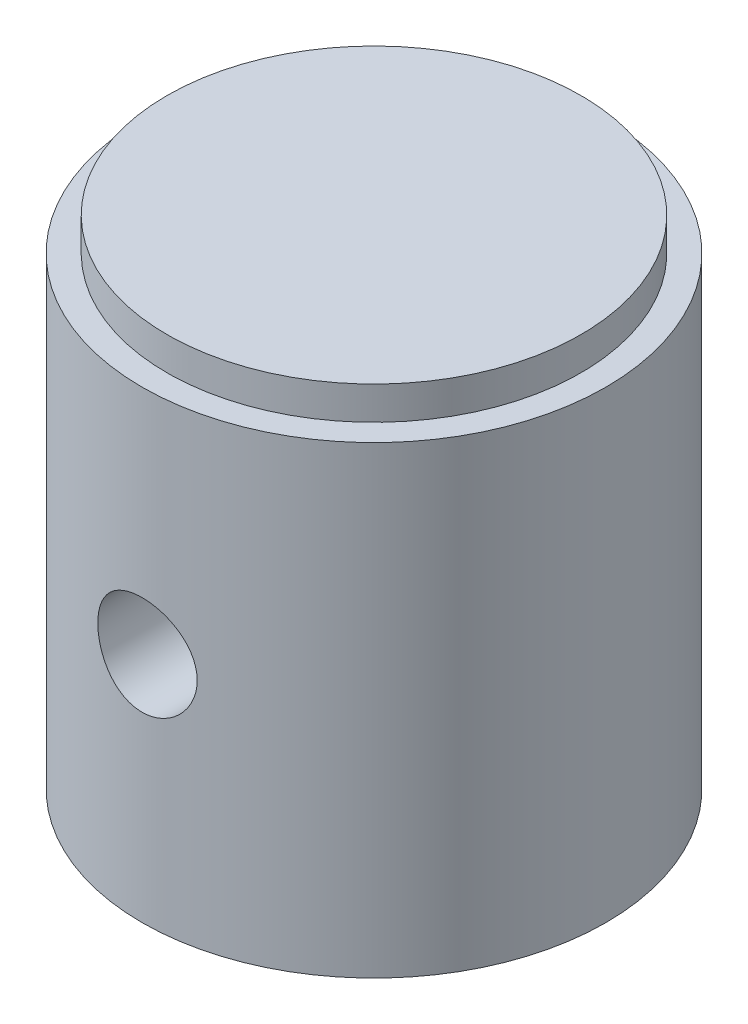
ISO-10303-21;
HEADER;
FILE_DESCRIPTION(('STEP AP214'),'2;1');
FILE_NAME('part.step','',(''),(''),'','','');
FILE_SCHEMA(('AUTOMOTIVE_DESIGN { 1 0 10303 214 1 1 1 1 }'));
ENDSEC;
DATA;
#1=APPLICATION_CONTEXT('core data for automotive mechanical design processes');
#2=APPLICATION_PROTOCOL_DEFINITION('international standard','automotive_design',2000,#1);
#3=PRODUCT_CONTEXT('',#1,'mechanical');
#4=PRODUCT('Part','Part','',(#3));
#5=PRODUCT_RELATED_PRODUCT_CATEGORY('part','',(#4));
#6=PRODUCT_DEFINITION_FORMATION('','',#4);
#7=PRODUCT_DEFINITION_CONTEXT('part definition',#1,'design');
#8=PRODUCT_DEFINITION('design','',#6,#7);
#9=PRODUCT_DEFINITION_SHAPE('','',#8);
#10=(LENGTH_UNIT() NAMED_UNIT(*) SI_UNIT(.MILLI.,.METRE.));
#11=(NAMED_UNIT(*) PLANE_ANGLE_UNIT() SI_UNIT($,.RADIAN.));
#12=(NAMED_UNIT(*) SI_UNIT($,.STERADIAN.) SOLID_ANGLE_UNIT());
#13=UNCERTAINTY_MEASURE_WITH_UNIT(LENGTH_MEASURE(1.E-05),#10,'distance_accuracy_value','');
#14=(GEOMETRIC_REPRESENTATION_CONTEXT(3) GLOBAL_UNCERTAINTY_ASSIGNED_CONTEXT((#13)) GLOBAL_UNIT_ASSIGNED_CONTEXT((#10,
#11,#12)) REPRESENTATION_CONTEXT('',''));
#15=CARTESIAN_POINT('',(0.,0.,0.));
#16=DIRECTION('',(0.,0.,1.));
#17=DIRECTION('',(1.,0.,0.));
#18=AXIS2_PLACEMENT_3D('',#15,#16,#17);
#19=CARTESIAN_POINT('',(0.,1.14591205961906,0.));
#20=DIRECTION('',(0.,1.,0.));
#21=DIRECTION('',(-1.,0.,0.));
#22=AXIS2_PLACEMENT_3D('',#19,#20,#21);
#23=PLANE('',#22);
#24=CARTESIAN_POINT('',(0.,1.14591205961906,0.));
#25=DIRECTION('',(0.,1.,0.));
#26=DIRECTION('',(-1.,0.,0.));
#27=AXIS2_PLACEMENT_3D('',#24,#25,#26);
#28=CIRCLE('',#27,6.25);
#29=CARTESIAN_POINT('',(-6.25,1.14591205961906,0.));
#30=VERTEX_POINT('',#29);
#31=EDGE_CURVE('E11',#30,#30,#28,.T.);
#32=ORIENTED_EDGE('',*,*,#31,.T.);
#33=EDGE_LOOP('',(#32));
#34=FACE_BOUND('',#33,.T.);
#35=ADVANCED_FACE('F42',(#34),#23,.T.);
#36=CARTESIAN_POINT('',(0.,1.14591205961906,0.));
#37=DIRECTION('',(0.,1.,0.));
#38=DIRECTION('',(-1.,0.,0.));
#39=AXIS2_PLACEMENT_3D('',#36,#37,#38);
#40=CYLINDRICAL_SURFACE('',#39,6.25);
#41=CARTESIAN_POINT('',(0.,0.145912059619056,0.));
#42=DIRECTION('',(0.,1.,0.));
#43=DIRECTION('',(-1.,0.,0.));
#44=AXIS2_PLACEMENT_3D('',#41,#42,#43);
#45=CIRCLE('',#44,6.25);
#46=CARTESIAN_POINT('',(-6.25,0.145912059619056,0.));
#47=VERTEX_POINT('',#46);
#48=EDGE_CURVE('E55',#47,#47,#45,.T.);
#49=ORIENTED_EDGE('',*,*,#48,.T.);
#50=EDGE_LOOP('',(#49));
#51=FACE_BOUND('',#50,.T.);
#52=ORIENTED_EDGE('',*,*,#31,.F.);
#53=EDGE_LOOP('',(#52));
#54=FACE_BOUND('',#53,.T.);
#55=ADVANCED_FACE('F130',(#51,#54),#40,.T.);
#56=CARTESIAN_POINT('',(-6.25,0.145912059619056,0.));
#57=DIRECTION('',(0.,1.,0.));
#58=DIRECTION('',(-1.,0.,0.));
#59=AXIS2_PLACEMENT_3D('',#56,#57,#58);
#60=PLANE('',#59);
#61=CARTESIAN_POINT('',(0.,0.145912059619056,0.));
#62=DIRECTION('',(0.,1.,0.));
#63=DIRECTION('',(-1.,0.,0.));
#64=AXIS2_PLACEMENT_3D('',#61,#62,#63);
#65=CIRCLE('',#64,7.);
#66=CARTESIAN_POINT('',(-7.,0.145912059619056,0.));
#67=VERTEX_POINT('',#66);
#68=EDGE_CURVE('E94',#67,#67,#65,.T.);
#69=ORIENTED_EDGE('',*,*,#68,.T.);
#70=EDGE_LOOP('',(#69));
#71=FACE_BOUND('',#70,.T.);
#72=ORIENTED_EDGE('',*,*,#48,.F.);
#73=EDGE_LOOP('',(#72));
#74=FACE_BOUND('',#73,.T.);
#75=ADVANCED_FACE('F126',(#71,#74),#60,.T.);
#76=CARTESIAN_POINT('',(0.,1.14591205961906,0.));
#77=DIRECTION('',(0.,1.,0.));
#78=DIRECTION('',(-1.,0.,0.));
#79=AXIS2_PLACEMENT_3D('',#76,#77,#78);
#80=CYLINDRICAL_SURFACE('',#79,7.);
#81=CARTESIAN_POINT('',(0.,-5.35408794038094,-7.));
#82=CARTESIAN_POINT('',(0.0832358860906167,-5.35409083995524,-6.99999846043226));
#83=CARTESIAN_POINT('',(0.166507195600275,-5.3610395487688,-6.9985002594971));
#84=CARTESIAN_POINT('',(0.330687344293327,-5.38862359723453,-6.99266829827727));
#85=CARTESIAN_POINT('',(0.41159440357119,-5.40926898457588,-6.98833245637099));
#86=CARTESIAN_POINT('',(0.568649323817737,-5.46357230498898,-6.97730831788826));
#87=CARTESIAN_POINT('',(0.644801963446556,-5.49721691976226,-6.97062242967171));
#88=CARTESIAN_POINT('',(0.790378177960787,-5.5765220265522,-6.95562106817971));
#89=CARTESIAN_POINT('',(0.859801981747369,-5.62218210963088,-6.9473056503666));
#90=CARTESIAN_POINT('',(0.99102479053523,-5.72496824005445,-6.92981369246311));
#91=CARTESIAN_POINT('',(1.05270503419445,-5.78224416227947,-6.92062683143259));
#92=CARTESIAN_POINT('',(1.16566042389435,-5.90631425606614,-6.90250069814144));
#93=CARTESIAN_POINT('',(1.21693467150908,-5.9731092486322,-6.8935614473163));
#94=CARTESIAN_POINT('',(1.30814204379809,-6.11519369324137,-6.87684116047225));
#95=CARTESIAN_POINT('',(1.34794958335009,-6.19056545813715,-6.8690733634436));
#96=CARTESIAN_POINT('',(1.41428823691148,-6.34712239414778,-6.85572325558537));
#97=CARTESIAN_POINT('',(1.44082087001716,-6.42830689887351,-6.85014069470711));
#98=CARTESIAN_POINT('',(1.47946574422454,-6.59289902696901,-6.8418980892631));
#99=CARTESIAN_POINT('',(1.49178779748342,-6.67625521604481,-6.83919556896486));
#100=CARTESIAN_POINT('',(1.50231395206577,-6.84389217288794,-6.83689139845106));
#101=CARTESIAN_POINT('',(1.50051971664629,-6.92817283056089,-6.83728938291729));
#102=CARTESIAN_POINT('',(1.48303326340861,-7.09371262831473,-6.84110276603832));
#103=CARTESIAN_POINT('',(1.46758398649408,-7.17499882948109,-6.84446541682162));
#104=CARTESIAN_POINT('',(1.42361054298677,-7.33379818067028,-6.85374593375788));
#105=CARTESIAN_POINT('',(1.39508566936466,-7.41131112641326,-6.85966393808402));
#106=CARTESIAN_POINT('',(1.32554551075991,-7.56105081325428,-6.87344080755724));
#107=CARTESIAN_POINT('',(1.2844361097283,-7.63323245309349,-6.88131420983365));
#108=CARTESIAN_POINT('',(1.19096007283993,-7.7697631053389,-6.89810572501288));
#109=CARTESIAN_POINT('',(1.13859196103562,-7.83411108906714,-6.90702397481896));
#110=CARTESIAN_POINT('',(1.0227954275532,-7.95454729605434,-6.92512718393878));
#111=CARTESIAN_POINT('',(0.959160233964409,-8.01043664696568,-6.93431383972178));
#112=CARTESIAN_POINT('',(0.823317306269096,-8.1107816740706,-6.95175017497059));
#113=CARTESIAN_POINT('',(0.751109428775399,-8.15523715898133,-6.95999983875972));
#114=CARTESIAN_POINT('',(0.599933462049958,-8.23149862028787,-6.97465778534003));
#115=CARTESIAN_POINT('',(0.520952258863481,-8.26327935295892,-6.98106238643354));
#116=CARTESIAN_POINT('',(0.358603146685705,-8.31306358870203,-6.99128109245334));
#117=CARTESIAN_POINT('',(0.275235851133668,-8.33106901294426,-6.99509555860384));
#118=CARTESIAN_POINT('',(0.108187670836628,-8.35250415452437,-6.99965306347808));
#119=CARTESIAN_POINT('',(0.0245431772716139,-8.35620565326272,-7.00045336521066));
#120=CARTESIAN_POINT('',(-0.142168973650405,-8.34966336925578,-6.99905248935969));
#121=CARTESIAN_POINT('',(-0.225236668127256,-8.339420492418,-6.99685150675698));
#122=CARTESIAN_POINT('',(-0.387542537982806,-8.30550569671924,-6.98973143045266));
#123=CARTESIAN_POINT('',(-0.466811712908478,-8.28197557090841,-6.98484105045459));
#124=CARTESIAN_POINT('',(-0.620278450473418,-8.22231099738612,-6.9728892442151));
#125=CARTESIAN_POINT('',(-0.69447559258774,-8.18617550606929,-6.96582763822237));
#126=CARTESIAN_POINT('',(-0.836821397964754,-8.10175439732062,-6.950175043904));
#127=CARTESIAN_POINT('',(-0.904872575111141,-8.05330814547121,-6.94156431354275));
#128=CARTESIAN_POINT('',(-1.0319769255236,-7.9458531154922,-6.92381033034847));
#129=CARTESIAN_POINT('',(-1.091028978692,-7.8868430244935,-6.91466701142097));
#130=CARTESIAN_POINT('',(-1.19952711057989,-7.7586905701938,-6.89668172706324));
#131=CARTESIAN_POINT('',(-1.24878537255157,-7.68938784115884,-6.88784792221285));
#132=CARTESIAN_POINT('',(-1.3349641538604,-7.54333334390295,-6.87166654559681));
#133=CARTESIAN_POINT('',(-1.37188519913706,-7.46658189340345,-6.86431891048055));
#134=CARTESIAN_POINT('',(-1.43209741248548,-7.30821564138634,-6.8520100980739));
#135=CARTESIAN_POINT('',(-1.45546398641275,-7.22663058395027,-6.84703574582967));
#136=CARTESIAN_POINT('',(-1.48812696085335,-7.0605723565473,-6.84001186708418));
#137=CARTESIAN_POINT('',(-1.49742550780258,-6.97609962917962,-6.83796189439706));
#138=CARTESIAN_POINT('',(-1.5015999992604,-6.8085555972057,-6.83704618848155));
#139=CARTESIAN_POINT('',(-1.49677347258311,-6.72549192540036,-6.83811476518543));
#140=CARTESIAN_POINT('',(-1.47349789406331,-6.56139069824835,-6.8431676318483));
#141=CARTESIAN_POINT('',(-1.45504898957979,-6.48035312099437,-6.84715189026714));
#142=CARTESIAN_POINT('',(-1.40519345940434,-6.32282928251177,-6.85755581104157));
#143=CARTESIAN_POINT('',(-1.37382847170887,-6.24632929171665,-6.86396764224703));
#144=CARTESIAN_POINT('',(-1.29906751595601,-6.09963256787409,-6.87850764590649));
#145=CARTESIAN_POINT('',(-1.255670353015,-6.0294364617659,-6.88663598880363));
#146=CARTESIAN_POINT('',(-1.15708290349304,-5.89586974665557,-6.90389055593232));
#147=CARTESIAN_POINT('',(-1.10167987421237,-5.83265824443396,-6.91303309938926));
#148=CARTESIAN_POINT('',(-0.98108655461962,-5.71633167786048,-6.93117449799694));
#149=CARTESIAN_POINT('',(-0.915894009385597,-5.66321894606874,-6.94017331951296));
#150=CARTESIAN_POINT('',(-0.776603147268717,-5.56797198087538,-6.95714491048987));
#151=CARTESIAN_POINT('',(-0.702404846009642,-5.52598133414996,-6.96510364570626));
#152=CARTESIAN_POINT('',(-0.547850160940599,-5.45513341147476,-6.97895826104019));
#153=CARTESIAN_POINT('',(-0.46749910586388,-5.42626491779591,-6.98485590212343));
#154=CARTESIAN_POINT('',(-0.322535217553203,-5.38773575524979,-6.99284848461772));
#155=CARTESIAN_POINT('',(-0.258717205545978,-5.37514150640091,-6.99551391888263));
#156=CARTESIAN_POINT('',(-0.129939960853846,-5.35831663866927,-6.99909024154719));
#157=CARTESIAN_POINT('',(-0.0649807750887446,-5.35408567673488,-7.00000120191314));
#158=CARTESIAN_POINT('',(0.,-5.35408794038094,-7.));
#159=B_SPLINE_CURVE_WITH_KNOTS('',3,(#81,#82,#83,#84,#85,#86,#87,#88,#89,#90,#91,#92,#93,#94,
#95,#96,#97,#98,#99,#100,#101,#102,#103,#104,#105,#106,#107,#108,#109,#110,#111,#112,#113,#114,
#115,#116,#117,#118,#119,#120,#121,#122,#123,#124,#125,#126,#127,#128,#129,#130,#131,#132,#133,
#134,#135,#136,#137,#138,#139,#140,#141,#142,#143,#144,#145,#146,#147,#148,#149,#150,#151,#152,
#153,#154,#155,#156,#157,#158),.UNSPECIFIED.,.T.,.F.,(4,2,2,2,2,2,2,2,2,2,2,2,2,2,2,2,2,2,2,2,2,
2,2,2,2,2,2,2,2,2,2,2,2,2,2,2,2,2,4),(0.,0.249469836512082,0.499122883219936,0.748520824425602,
0.997910278645887,1.25074961881732,1.50361077918506,1.7591442921451,2.0146485567749,
2.26633008124666,2.51798195169165,2.76524475452928,3.01252092904568,3.26169356165968,
3.51089887920889,3.76527011050291,4.0196455970235,4.27452521139806,4.52936927256343,
4.77934665704185,5.02930780231429,5.27665060589267,5.52401389198434,5.77478733867803,
6.02559197304485,6.28082063283534,6.53603841075806,6.78982240408475,7.04356767229185,
7.29200680540294,7.5404432510827,7.78808499706785,8.03575134451623,8.28822950154114,
8.54076590397115,8.79641910357222,9.05185334010271,9.24661799132294,9.44137465337336),.UNSPECIFIED.);
#160=CARTESIAN_POINT('',(0.,-5.35408794038094,-7.));
#161=VERTEX_POINT('',#160);
#162=EDGE_CURVE('E71',#161,#161,#159,.T.);
#163=ORIENTED_EDGE('',*,*,#162,.F.);
#164=EDGE_LOOP('',(#163));
#165=FACE_BOUND('',#164,.T.);
#166=CARTESIAN_POINT('',(1.5,-6.85408794038094,6.83739716558867));
#167=CARTESIAN_POINT('',(1.49999708238613,-6.77087678789899,6.83739884558951));
#168=CARTESIAN_POINT('',(1.49305236244768,-6.68763016643882,6.83893272341929));
#169=CARTESIAN_POINT('',(1.46548559252999,-6.52350126813893,6.84489178429867));
#170=CARTESIAN_POINT('',(1.44485339653622,-6.44262079170474,6.84931911211841));
#171=CARTESIAN_POINT('',(1.39058863684599,-6.28562219080674,6.86054115293409));
#172=CARTESIAN_POINT('',(1.35697000991314,-6.20949906225948,6.86733332725825));
#173=CARTESIAN_POINT('',(1.27772617673341,-6.06397266643633,6.88251670848644));
#174=CARTESIAN_POINT('',(1.23210132048776,-5.99456920335186,6.89090786877545));
#175=CARTESIAN_POINT('',(1.12935142570221,-5.86332497889882,6.90849578796654));
#176=CARTESIAN_POINT('',(1.07206859483983,-5.80160906414098,6.91770249871753));
#177=CARTESIAN_POINT('',(0.947969508129577,-5.68858438597515,6.93579691710397));
#178=CARTESIAN_POINT('',(0.881152530217675,-5.63727641152087,6.94468460051416));
#179=CARTESIAN_POINT('',(0.739047288464581,-5.54603249588951,6.96124769109432));
#180=CARTESIAN_POINT('',(0.663680488229953,-5.50621628461032,6.96890998819429));
#181=CARTESIAN_POINT('',(0.507134269342595,-5.43986024893465,6.98204671042934));
#182=CARTESIAN_POINT('',(0.425955477380311,-5.41331899559466,6.98752137103329));
#183=CARTESIAN_POINT('',(0.261387187671511,-5.3746579694496,6.9955956528118));
#184=CARTESIAN_POINT('',(0.178049400596923,-5.36232701182851,6.99823733378385));
#185=CARTESIAN_POINT('',(0.0104489453066437,-5.35177666306768,7.00049362207002));
#186=CARTESIAN_POINT('',(-0.0738136201647602,-5.35355571982018,7.00010856232698));
#187=CARTESIAN_POINT('',(-0.239417029250513,-5.37101690504452,6.99638700862558));
#188=CARTESIAN_POINT('',(-0.320783115362113,-5.38647144067086,6.99309883152431));
#189=CARTESIAN_POINT('',(-0.479739463978389,-5.4304826222328,6.98399541589104));
#190=CARTESIAN_POINT('',(-0.557329560175055,-5.45903984468068,6.97818006616518));
#191=CARTESIAN_POINT('',(-0.707167497556553,-5.52864939926946,6.96459754646858));
#192=CARTESIAN_POINT('',(-0.779373657015789,-5.56978870758529,6.95681685803946));
#193=CARTESIAN_POINT('',(-0.915940926562847,-5.66332990854454,6.94015793743865));
#194=CARTESIAN_POINT('',(-0.980301006451529,-5.71573327768124,6.93127956144693));
#195=CARTESIAN_POINT('',(-1.10070208800198,-5.8315564849088,6.91319326460925));
#196=CARTESIAN_POINT('',(-1.1565511732025,-5.89517551973798,6.90398230372853));
#197=CARTESIAN_POINT('',(-1.25682243234728,-6.03097122544945,6.88643566831974));
#198=CARTESIAN_POINT('',(-1.30124432118068,-6.10314810978619,6.87810001563386));
#199=CARTESIAN_POINT('',(-1.37748077573296,-6.2543124414447,6.86324023586723));
#200=CARTESIAN_POINT('',(-1.40926035088923,-6.33331806423338,6.85672115127775));
#201=CARTESIAN_POINT('',(-1.45903495159116,-6.49572070632738,6.84630340806616));
#202=CARTESIAN_POINT('',(-1.47703206694628,-6.57911705782413,6.84240435218483));
#203=CARTESIAN_POINT('',(-1.49843586024652,-6.74618369303065,6.83774881255446));
#204=CARTESIAN_POINT('',(-1.5021214192864,-6.82981661545825,6.83693227051701));
#205=CARTESIAN_POINT('',(-1.49555139642373,-6.99650193356264,6.83837239573993));
#206=CARTESIAN_POINT('',(-1.48529673081635,-7.07955436703449,6.84062886101063));
#207=CARTESIAN_POINT('',(-1.45137894635584,-7.2417583753617,6.84790415484205));
#208=CARTESIAN_POINT('',(-1.42786830251553,-7.3209433729779,6.85289155274364));
#209=CARTESIAN_POINT('',(-1.36827052946749,-7.47425027791386,6.86503859869777));
#210=CARTESIAN_POINT('',(-1.33218223662818,-7.54837171601513,6.87219844772849));
#211=CARTESIAN_POINT('',(-1.24783504416705,-7.69065762513986,6.88801634080345));
#212=CARTESIAN_POINT('',(-1.19940368590792,-7.75871752239313,6.89669501746317));
#213=CARTESIAN_POINT('',(-1.09197183833601,-7.88584628625474,6.91451775360139));
#214=CARTESIAN_POINT('',(-1.03297009182161,-7.94491408182941,6.92366186834461));
#215=CARTESIAN_POINT('',(-0.904812764420814,-8.0534582433257,6.94158239990173));
#216=CARTESIAN_POINT('',(-0.835494925828771,-8.10274485653795,6.95034935607746));
#217=CARTESIAN_POINT('',(-0.689401481282275,-8.18897334973199,6.96635610714901));
#218=CARTESIAN_POINT('',(-0.612626216043739,-8.22591579335377,6.97359597176692));
#219=CARTESIAN_POINT('',(-0.454265418982039,-8.28613999501942,6.98569278381574));
#220=CARTESIAN_POINT('',(-0.372713193075171,-8.30950624412722,6.99056443803698));
#221=CARTESIAN_POINT('',(-0.206725177003288,-8.34217964611326,6.9974393930198));
#222=CARTESIAN_POINT('',(-0.122289789973992,-8.35148875635485,6.99944309312296));
#223=CARTESIAN_POINT('',(0.0452637170528297,-8.3556985927928,7.00034511009056));
#224=CARTESIAN_POINT('',(0.12837450550923,-8.35088309898556,6.99930459001667));
#225=CARTESIAN_POINT('',(0.292572938415961,-8.32761317686191,6.99436552363383));
#226=CARTESIAN_POINT('',(0.373660616405285,-8.30915897480262,6.99046702473686));
#227=CARTESIAN_POINT('',(0.53130194848727,-8.25926913413145,6.98025388638537));
#228=CARTESIAN_POINT('',(0.607868365073178,-8.22787225099538,6.97394646430492));
#229=CARTESIAN_POINT('',(0.75468495672322,-8.15302666921182,6.9595903605066));
#230=CARTESIAN_POINT('',(0.824934544796142,-8.10957685207491,6.9515415172034));
#231=CARTESIAN_POINT('',(0.958512306895244,-8.01092562163827,6.93439809934493));
#232=CARTESIAN_POINT('',(1.02169036510577,-7.95552378205963,6.92528708907874));
#233=CARTESIAN_POINT('',(1.13795001457643,-7.83494733013059,6.90713690075836));
#234=CARTESIAN_POINT('',(1.19102918062422,-7.76977037702533,6.89809774045682));
#235=CARTESIAN_POINT('',(1.28623261596675,-7.63049744719526,6.88098693651915));
#236=CARTESIAN_POINT('',(1.32820897809616,-7.55629858209392,6.87292905956533));
#237=CARTESIAN_POINT('',(1.39903004659825,-7.40174421945769,6.85886497228049));
#238=CARTESIAN_POINT('',(1.42788606423931,-7.32139409512787,6.85285699581573));
#239=CARTESIAN_POINT('',(1.46638607121558,-7.17646180919508,6.84470560641996));
#240=CARTESIAN_POINT('',(1.47896752507743,-7.11267626467311,6.84198283087953));
#241=CARTESIAN_POINT('',(1.49577544043437,-6.98396362880362,6.83832799504406));
#242=CARTESIAN_POINT('',(1.50000227727981,-6.91903658887262,6.83739585430069));
#243=CARTESIAN_POINT('',(1.5,-6.85408794038094,6.83739716558867));
#244=B_SPLINE_CURVE_WITH_KNOTS('',3,(#166,#167,#168,#169,#170,#171,#172,#173,#174,#175,#176,
#177,#178,#179,#180,#181,#182,#183,#184,#185,#186,#187,#188,#189,#190,#191,#192,#193,#194,#195,
#196,#197,#198,#199,#200,#201,#202,#203,#204,#205,#206,#207,#208,#209,#210,#211,#212,#213,#214,
#215,#216,#217,#218,#219,#220,#221,#222,#223,#224,#225,#226,#227,#228,#229,#230,#231,#232,#233,
#234,#235,#236,#237,#238,#239,#240,#241,#242,#243),.UNSPECIFIED.,.T.,.F.,(4,2,2,2,2,2,2,2,2,2,2,
2,2,2,2,2,2,2,2,2,2,2,2,2,2,2,2,2,2,2,2,2,2,2,2,2,2,2,4),(0.,0.249395482027528,
0.498976038479964,0.748289491152759,0.997595676735283,1.25053229582692,1.50348808112879,
1.75899134820278,2.01446710646268,2.26609508151929,2.51769537777241,2.76518557667372,
3.01268666607584,3.26193888143437,3.51122378872315,3.76548960779295,4.01976177023092,
4.27473287411781,4.52966530953839,4.77960433192523,5.02952692653917,5.27663180749375,
5.5237595556315,5.77455010216318,6.02537049659078,6.2806621468321,6.53594213875541,
6.78961589824375,7.04325433208539,7.29183199644127,7.540405537151,7.78824009619483,
8.03609766151365,8.28848914160965,8.54094115631232,8.79660380167248,9.05204561611687,
9.24671456122272,9.44137476018022),.UNSPECIFIED.);
#245=CARTESIAN_POINT('',(1.5,-6.85408794038094,6.83739716558867));
#246=VERTEX_POINT('',#245);
#247=EDGE_CURVE('E79',#246,#246,#244,.T.);
#248=ORIENTED_EDGE('',*,*,#247,.F.);
#249=EDGE_LOOP('',(#248));
#250=FACE_BOUND('',#249,.T.);
#251=CARTESIAN_POINT('',(0.,-13.8540879403809,0.));
#252=DIRECTION('',(0.,1.,0.));
#253=DIRECTION('',(-1.,0.,0.));
#254=AXIS2_PLACEMENT_3D('',#251,#252,#253);
#255=CIRCLE('',#254,7.);
#256=CARTESIAN_POINT('',(-7.,-13.8540879403809,0.));
#257=VERTEX_POINT('',#256);
#258=EDGE_CURVE('E90',#257,#257,#255,.T.);
#259=ORIENTED_EDGE('',*,*,#258,.T.);
#260=EDGE_LOOP('',(#259));
#261=FACE_BOUND('',#260,.T.);
#262=ORIENTED_EDGE('',*,*,#68,.F.);
#263=EDGE_LOOP('',(#262));
#264=FACE_BOUND('',#263,.T.);
#265=ADVANCED_FACE('F120',(#165,#250,#261,#264),#80,.T.);
#266=CARTESIAN_POINT('',(-7.,-13.8540879403809,0.));
#267=DIRECTION('',(0.,-1.,0.));
#268=DIRECTION('',(1.,0.,0.));
#269=AXIS2_PLACEMENT_3D('',#266,#267,#268);
#270=PLANE('',#269);
#271=CARTESIAN_POINT('',(0.,-13.8540879403809,0.));
#272=DIRECTION('',(0.,1.,0.));
#273=DIRECTION('',(-1.,0.,0.));
#274=AXIS2_PLACEMENT_3D('',#271,#272,#273);
#275=CIRCLE('',#274,6.25);
#276=CARTESIAN_POINT('',(-6.25,-13.8540879403809,0.));
#277=VERTEX_POINT('',#276);
#278=EDGE_CURVE('E76',#277,#277,#275,.T.);
#279=ORIENTED_EDGE('',*,*,#278,.T.);
#280=EDGE_LOOP('',(#279));
#281=FACE_BOUND('',#280,.T.);
#282=ORIENTED_EDGE('',*,*,#258,.F.);
#283=EDGE_LOOP('',(#282));
#284=FACE_BOUND('',#283,.T.);
#285=ADVANCED_FACE('F125',(#281,#284),#270,.T.);
#286=CARTESIAN_POINT('',(0.,-13.8540879403809,0.));
#287=DIRECTION('',(0.,-1.,0.));
#288=DIRECTION('',(1.,0.,0.));
#289=AXIS2_PLACEMENT_3D('',#286,#287,#288);
#290=CONICAL_SURFACE('',#289,6.25,0.349065850398867);
#291=CARTESIAN_POINT('',(0.,-9.73287181119902,0.));
#292=DIRECTION('',(0.,1.,0.));
#293=DIRECTION('',(-1.,0.,0.));
#294=AXIS2_PLACEMENT_3D('',#291,#292,#293);
#295=CIRCLE('',#294,4.75);
#296=CARTESIAN_POINT('',(-4.75,-9.73287181119902,0.));
#297=VERTEX_POINT('',#296);
#298=EDGE_CURVE('E70',#297,#297,#295,.T.);
#299=ORIENTED_EDGE('',*,*,#298,.T.);
#300=EDGE_LOOP('',(#299));
#301=FACE_BOUND('',#300,.T.);
#302=ORIENTED_EDGE('',*,*,#278,.F.);
#303=EDGE_LOOP('',(#302));
#304=FACE_BOUND('',#303,.T.);
#305=ADVANCED_FACE('F167',(#301,#304),#290,.F.);
#306=CARTESIAN_POINT('',(0.,1.14591205961906,0.));
#307=DIRECTION('',(0.,1.,0.));
#308=DIRECTION('',(-1.,0.,0.));
#309=AXIS2_PLACEMENT_3D('',#306,#307,#308);
#310=CYLINDRICAL_SURFACE('',#309,4.75);
#311=CARTESIAN_POINT('',(1.5,-6.85408794038094,-4.50693909432999));
#312=CARTESIAN_POINT('',(1.49999958004515,-6.7721196577048,-4.50693949515469));
#313=CARTESIAN_POINT('',(1.49325840231682,-6.6901469566562,-4.50919970874085));
#314=CARTESIAN_POINT('',(1.46655104887094,-6.52861293088149,-4.5179553253781));
#315=CARTESIAN_POINT('',(1.44658152131253,-6.44905222265826,-4.52445180182028));
#316=CARTESIAN_POINT('',(1.39417508352591,-6.29470573753141,-4.54087234787262));
#317=CARTESIAN_POINT('',(1.36176059537411,-6.21991165356943,-4.55079024986066));
#318=CARTESIAN_POINT('',(1.28545946652237,-6.07680188437629,-4.57292751994247));
#319=CARTESIAN_POINT('',(1.24157071835092,-6.00848739239298,-4.58514731070763));
#320=CARTESIAN_POINT('',(1.14191784971278,-5.87787926892888,-4.6109923380212));
#321=CARTESIAN_POINT('',(1.08582030493755,-5.81584637664503,-4.62464992232587));
#322=CARTESIAN_POINT('',(0.964055421977067,-5.70189358755744,-4.65155671093151));
#323=CARTESIAN_POINT('',(0.89838672023377,-5.6499751341773,-4.66480585671778));
#324=CARTESIAN_POINT('',(0.757464836701734,-5.55656943425556,-4.68977365915903));
#325=CARTESIAN_POINT('',(0.682025001056138,-5.51535142867759,-4.70144979545653));
#326=CARTESIAN_POINT('',(0.524852067423557,-5.44629068315636,-4.72157773016224));
#327=CARTESIAN_POINT('',(0.443120487221091,-5.41844472907479,-4.73003030329318));
#328=CARTESIAN_POINT('',(0.278414775826808,-5.37779120927982,-4.74252974850081));
#329=CARTESIAN_POINT('',(0.195560751143444,-5.36453783892489,-4.74670693307633));
#330=CARTESIAN_POINT('',(0.0287067286102963,-5.35203243628337,-4.75064554540298));
#331=CARTESIAN_POINT('',(-0.0552929988694209,-5.35277715587087,-4.75040799755164));
#332=CARTESIAN_POINT('',(-0.218913619351865,-5.36795513993682,-4.74563427350171));
#333=CARTESIAN_POINT('',(-0.298584494979865,-5.38190499009779,-4.74124990899214));
#334=CARTESIAN_POINT('',(-0.45439031175481,-5.42230309803136,-4.72886249486103));
#335=CARTESIAN_POINT('',(-0.530525020335842,-5.44875217657593,-4.72085920760149));
#336=CARTESIAN_POINT('',(-0.678203652675079,-5.51370412226577,-4.7019310355991));
#337=CARTESIAN_POINT('',(-0.74967901329581,-5.55235226805692,-4.69097118266663));
#338=CARTESIAN_POINT('',(-0.885279102378908,-5.64048825496808,-4.66728249867119));
#339=CARTESIAN_POINT('',(-0.949401935733848,-5.68997888120319,-4.65455321340063));
#340=CARTESIAN_POINT('',(-1.07135837440922,-5.80086990661586,-4.62803989727125));
#341=CARTESIAN_POINT('',(-1.12880871974839,-5.86268717443352,-4.61423403233704));
#342=CARTESIAN_POINT('',(-1.23264301054731,-5.99520609936009,-4.58758892442481));
#343=CARTESIAN_POINT('',(-1.2790255944206,-6.06590884795354,-4.57474980051078));
#344=CARTESIAN_POINT('',(-1.35986638692084,-6.21529471221219,-4.55138024059369));
#345=CARTESIAN_POINT('',(-1.39417963639867,-6.29406107899704,-4.54087839223385));
#346=CARTESIAN_POINT('',(-1.44893342452635,-6.45666604209655,-4.5237069894911));
#347=CARTESIAN_POINT('',(-1.46937907304313,-6.54050275769758,-4.5170360236621));
#348=CARTESIAN_POINT('',(-1.49507161979025,-6.70719030070485,-4.5085959379324));
#349=CARTESIAN_POINT('',(-1.50090655288536,-6.78994094405971,-4.50663729609299));
#350=CARTESIAN_POINT('',(-1.49886513965521,-6.95524565634742,-4.50731687465407));
#351=CARTESIAN_POINT('',(-1.49099096720734,-7.03779975436821,-4.50995436623754));
#352=CARTESIAN_POINT('',(-1.46228084598241,-7.19781462827841,-4.51934163323602));
#353=CARTESIAN_POINT('',(-1.4418371919129,-7.27535386104789,-4.5259668251803));
#354=CARTESIAN_POINT('',(-1.38903056686353,-7.42589187285975,-4.54245022183902));
#355=CARTESIAN_POINT('',(-1.35666562487664,-7.49888989874716,-4.55230896114271));
#356=CARTESIAN_POINT('',(-1.2798587413425,-7.64062964410245,-4.57450539166733));
#357=CARTESIAN_POINT('',(-1.2350921421442,-7.7091851686548,-4.58690698850856));
#358=CARTESIAN_POINT('',(-1.13512998682984,-7.83802498613951,-4.61266077618539));
#359=CARTESIAN_POINT('',(-1.07993166463934,-7.89830707795434,-4.62601321856053));
#360=CARTESIAN_POINT('',(-0.957886037531119,-8.01152971698893,-4.65285013455169));
#361=CARTESIAN_POINT('',(-0.890643665109767,-8.06404992326935,-4.66631614662306));
#362=CARTESIAN_POINT('',(-0.747973360630615,-8.15707924857227,-4.6912975579683));
#363=CARTESIAN_POINT('',(-0.672545793179843,-8.19758890230142,-4.70281304406929));
#364=CARTESIAN_POINT('',(-0.516099288450846,-8.26506030291257,-4.72253168708172));
#365=CARTESIAN_POINT('',(-0.435125281433141,-8.29211897216546,-4.73075845435933));
#366=CARTESIAN_POINT('',(-0.269469399491867,-8.33214098472394,-4.7430763734001));
#367=CARTESIAN_POINT('',(-0.184788721002361,-8.34510884184619,-4.74716884950256));
#368=CARTESIAN_POINT('',(-0.0179886485878242,-8.3562082436468,-4.7506674317259));
#369=CARTESIAN_POINT('',(0.0640868361538645,-8.35494634309597,-4.75026513795577));
#370=CARTESIAN_POINT('',(0.226803220963032,-8.33909339504489,-4.74528029002945));
#371=CARTESIAN_POINT('',(0.307444217580877,-8.32450324810922,-4.74069801830655));
#372=CARTESIAN_POINT('',(0.463969836764499,-8.28279688043806,-4.72793024704182));
#373=CARTESIAN_POINT('',(0.539902672774311,-8.25584600763334,-4.71979237633648));
#374=CARTESIAN_POINT('',(0.686204345183072,-8.19033308378633,-4.70075227796056));
#375=CARTESIAN_POINT('',(0.756572215112847,-8.15176902144508,-4.68984957149724));
#376=CARTESIAN_POINT('',(0.892382156713933,-8.06259062090747,-4.66594837362514));
#377=CARTESIAN_POINT('',(0.957571386267192,-8.01160726897528,-4.65289067194133));
#378=CARTESIAN_POINT('',(1.07867009763973,-7.89968472788248,-4.62631837968684));
#379=CARTESIAN_POINT('',(1.13457676425287,-7.83874252949153,-4.61280365200012));
#380=CARTESIAN_POINT('',(1.23744612372159,-7.7061464976088,-4.58630016066439));
#381=CARTESIAN_POINT('',(1.28403955823579,-7.63419864212287,-4.5733449634976));
#382=CARTESIAN_POINT('',(1.36442560849337,-7.48310188366027,-4.55001145096037));
#383=CARTESIAN_POINT('',(1.39822313048984,-7.40395575513592,-4.53963214845841));
#384=CARTESIAN_POINT('',(1.44974900503547,-7.2471414878097,-4.52342799882926));
#385=CARTESIAN_POINT('',(1.46853682069789,-7.16985149452304,-4.51730787458817));
#386=CARTESIAN_POINT('',(1.4936609032698,-7.01307131452837,-4.50906374742014));
#387=CARTESIAN_POINT('',(1.50000040727695,-6.93358170526922,-4.50693870560567));
#388=CARTESIAN_POINT('',(1.5,-6.85408794038094,-4.50693909432999));
#389=B_SPLINE_CURVE_WITH_KNOTS('',3,(#311,#312,#313,#314,#315,#316,#317,#318,#319,#320,#321,
#322,#323,#324,#325,#326,#327,#328,#329,#330,#331,#332,#333,#334,#335,#336,#337,#338,#339,#340,
#341,#342,#343,#344,#345,#346,#347,#348,#349,#350,#351,#352,#353,#354,#355,#356,#357,#358,#359,
#360,#361,#362,#363,#364,#365,#366,#367,#368,#369,#370,#371,#372,#373,#374,#375,#376,#377,#378,
#379,#380,#381,#382,#383,#384,#385,#386,#387,#388),.UNSPECIFIED.,.T.,.F.,(4,2,2,2,2,2,2,2,2,2,2,
2,2,2,2,2,2,2,2,2,2,2,2,2,2,2,2,2,2,2,2,2,2,2,2,2,2,2,4),(0.,0.245611090579274,
0.491284438685785,0.736517218845769,0.981795072467575,1.23487733964253,1.48799569757339,
1.74697244897189,2.00588692090239,2.25665093580603,2.50735676398231,2.74922580012767,
2.99111072100683,3.23599243602231,3.48093712787276,3.7362950135404,3.99168429786021,
4.25004385973256,4.50830817072249,4.75599786818586,5.00364829262799,5.24393641423545,
5.48426428174337,5.7316004031664,5.97900220045884,6.23690747266809,6.49480126127746,
6.75080881416402,7.0067343340116,7.25179355317672,7.49683621537552,7.73869250201122,
7.9805907000726,8.2308132702795,8.48111158966217,8.739930558781,8.99865018989115,
9.23690856092584,9.47510496630383),.UNSPECIFIED.);
#390=CARTESIAN_POINT('',(1.5,-6.85408794038094,-4.50693909432999));
#391=VERTEX_POINT('',#390);
#392=EDGE_CURVE('E45',#391,#391,#389,.T.);
#393=ORIENTED_EDGE('',*,*,#392,.F.);
#394=EDGE_LOOP('',(#393));
#395=FACE_BOUND('',#394,.T.);
#396=CARTESIAN_POINT('',(1.5,-6.85408794038094,4.50693909432999));
#397=CARTESIAN_POINT('',(1.49999958004515,-6.93605622305708,4.50693949515469));
#398=CARTESIAN_POINT('',(1.49325840231682,-7.01802892410568,4.50919970874085));
#399=CARTESIAN_POINT('',(1.46655104887094,-7.17956294988039,4.5179553253781));
#400=CARTESIAN_POINT('',(1.44658152131253,-7.25912365810362,4.52445180182028));
#401=CARTESIAN_POINT('',(1.39417508352591,-7.41347014323047,4.54087234787262));
#402=CARTESIAN_POINT('',(1.36176059537411,-7.48826422719245,4.55079024986066));
#403=CARTESIAN_POINT('',(1.28545946652237,-7.63137399638559,4.57292751994247));
#404=CARTESIAN_POINT('',(1.24157071835092,-7.69968848836891,4.58514731070763));
#405=CARTESIAN_POINT('',(1.14191784971278,-7.830296611833,4.6109923380212));
#406=CARTESIAN_POINT('',(1.08582030493755,-7.89232950411685,4.62464992232587));
#407=CARTESIAN_POINT('',(0.964055421977067,-8.00628229320445,4.65155671093151));
#408=CARTESIAN_POINT('',(0.89838672023377,-8.05820074658458,4.66480585671778));
#409=CARTESIAN_POINT('',(0.757464836701734,-8.15160644650632,4.68977365915903));
#410=CARTESIAN_POINT('',(0.682025001056138,-8.19282445208429,4.70144979545653));
#411=CARTESIAN_POINT('',(0.524852067423557,-8.26188519760552,4.72157773016224));
#412=CARTESIAN_POINT('',(0.443120487221091,-8.28973115168709,4.73003030329318));
#413=CARTESIAN_POINT('',(0.278414775826807,-8.33038467148206,4.74252974850081));
#414=CARTESIAN_POINT('',(0.195560751143444,-8.343638041837,4.74670693307633));
#415=CARTESIAN_POINT('',(0.0287067286102964,-8.35614344447851,4.75064554540298));
#416=CARTESIAN_POINT('',(-0.0552929988694209,-8.35539872489102,4.75040799755164));
#417=CARTESIAN_POINT('',(-0.218913619351864,-8.34022074082506,4.74563427350171));
#418=CARTESIAN_POINT('',(-0.298584494979865,-8.32627089066409,4.74124990899214));
#419=CARTESIAN_POINT('',(-0.45439031175481,-8.28587278273052,4.72886249486103));
#420=CARTESIAN_POINT('',(-0.530525020335842,-8.25942370418595,4.72085920760149));
#421=CARTESIAN_POINT('',(-0.678203652675079,-8.19447175849612,4.7019310355991));
#422=CARTESIAN_POINT('',(-0.74967901329581,-8.15582361270496,4.69097118266663));
#423=CARTESIAN_POINT('',(-0.885279102378908,-8.0676876257938,4.66728249867119));
#424=CARTESIAN_POINT('',(-0.949401935733848,-8.01819699955869,4.65455321340063));
#425=CARTESIAN_POINT('',(-1.07135837440922,-7.90730597414602,4.62803989727125));
#426=CARTESIAN_POINT('',(-1.12880871974839,-7.84548870632835,4.61423403233704));
#427=CARTESIAN_POINT('',(-1.23264301054731,-7.71296978140179,4.58758892442481));
#428=CARTESIAN_POINT('',(-1.2790255944206,-7.64226703280834,4.57474980051078));
#429=CARTESIAN_POINT('',(-1.35986638692084,-7.49288116854969,4.55138024059369));
#430=CARTESIAN_POINT('',(-1.39417963639867,-7.41411480176484,4.54087839223385));
#431=CARTESIAN_POINT('',(-1.44893342452635,-7.25150983866533,4.5237069894911));
#432=CARTESIAN_POINT('',(-1.46937907304313,-7.1676731230643,4.5170360236621));
#433=CARTESIAN_POINT('',(-1.49507161979025,-7.00098558005703,4.5085959379324));
#434=CARTESIAN_POINT('',(-1.50090655288536,-6.91823493670217,4.50663729609299));
#435=CARTESIAN_POINT('',(-1.49886513965521,-6.75293022441446,4.50731687465407));
#436=CARTESIAN_POINT('',(-1.49099096720734,-6.67037612639367,4.50995436623754));
#437=CARTESIAN_POINT('',(-1.46228084598241,-6.51036125248347,4.51934163323602));
#438=CARTESIAN_POINT('',(-1.4418371919129,-6.43282201971399,4.5259668251803));
#439=CARTESIAN_POINT('',(-1.38903056686353,-6.28228400790213,4.54245022183902));
#440=CARTESIAN_POINT('',(-1.35666562487664,-6.20928598201472,4.55230896114271));
#441=CARTESIAN_POINT('',(-1.2798587413425,-6.06754623665943,4.57450539166733));
#442=CARTESIAN_POINT('',(-1.2350921421442,-5.99899071210708,4.58690698850856));
#443=CARTESIAN_POINT('',(-1.13512998682984,-5.87015089462237,4.61266077618539));
#444=CARTESIAN_POINT('',(-1.07993166463933,-5.80986880280754,4.62601321856053));
#445=CARTESIAN_POINT('',(-0.957886037531118,-5.69664616377295,4.65285013455169));
#446=CARTESIAN_POINT('',(-0.890643665109766,-5.64412595749253,4.66631614662306));
#447=CARTESIAN_POINT('',(-0.747973360630615,-5.55109663218961,4.6912975579683));
#448=CARTESIAN_POINT('',(-0.672545793179843,-5.51058697846045,4.70281304406929));
#449=CARTESIAN_POINT('',(-0.516099288450846,-5.44311557784931,4.72253168708172));
#450=CARTESIAN_POINT('',(-0.435125281433141,-5.41605690859642,4.73075845435933));
#451=CARTESIAN_POINT('',(-0.269469399491866,-5.37603489603794,4.7430763734001));
#452=CARTESIAN_POINT('',(-0.18478872100236,-5.36306703891569,4.74716884950256));
#453=CARTESIAN_POINT('',(-0.0179886485878232,-5.35196763711508,4.7506674317259));
#454=CARTESIAN_POINT('',(0.0640868361538654,-5.35322953766592,4.75026513795577));
#455=CARTESIAN_POINT('',(0.226803220963033,-5.36908248571699,4.74528029002945));
#456=CARTESIAN_POINT('',(0.307444217580877,-5.38367263265266,4.74069801830655));
#457=CARTESIAN_POINT('',(0.4639698367645,-5.42537900032382,4.72793024704182));
#458=CARTESIAN_POINT('',(0.539902672774312,-5.45232987312854,4.71979237633648));
#459=CARTESIAN_POINT('',(0.686204345183072,-5.51784279697555,4.70075227796056));
#460=CARTESIAN_POINT('',(0.756572215112847,-5.5564068593168,4.68984957149724));
#461=CARTESIAN_POINT('',(0.892382156713933,-5.64558525985441,4.66594837362514));
#462=CARTESIAN_POINT('',(0.957571386267192,-5.6965686117866,4.65289067194133));
#463=CARTESIAN_POINT('',(1.07867009763973,-5.8084911528794,4.62631837968684));
#464=CARTESIAN_POINT('',(1.13457676425287,-5.86943335127035,4.61280365200012));
#465=CARTESIAN_POINT('',(1.23744612372159,-6.00202938315308,4.58630016066439));
#466=CARTESIAN_POINT('',(1.28403955823579,-6.07397723863901,4.5733449634976));
#467=CARTESIAN_POINT('',(1.36442560849337,-6.22507399710161,4.55001145096037));
#468=CARTESIAN_POINT('',(1.39822313048985,-6.30422012562596,4.5396321484584));
#469=CARTESIAN_POINT('',(1.44974900503547,-6.46103439295218,4.52342799882925));
#470=CARTESIAN_POINT('',(1.46853682069789,-6.53832438623884,4.51730787458817));
#471=CARTESIAN_POINT('',(1.4936609032698,-6.69510456623351,4.50906374742014));
#472=CARTESIAN_POINT('',(1.50000040727695,-6.77459417549266,4.50693870560567));
#473=CARTESIAN_POINT('',(1.5,-6.85408794038094,4.50693909432999));
#474=B_SPLINE_CURVE_WITH_KNOTS('',3,(#396,#397,#398,#399,#400,#401,#402,#403,#404,#405,#406,
#407,#408,#409,#410,#411,#412,#413,#414,#415,#416,#417,#418,#419,#420,#421,#422,#423,#424,#425,
#426,#427,#428,#429,#430,#431,#432,#433,#434,#435,#436,#437,#438,#439,#440,#441,#442,#443,#444,
#445,#446,#447,#448,#449,#450,#451,#452,#453,#454,#455,#456,#457,#458,#459,#460,#461,#462,#463,
#464,#465,#466,#467,#468,#469,#470,#471,#472,#473),.UNSPECIFIED.,.T.,.F.,(4,2,2,2,2,2,2,2,2,2,2,
2,2,2,2,2,2,2,2,2,2,2,2,2,2,2,2,2,2,2,2,2,2,2,2,2,2,2,4),(0.,0.245611090579273,
0.491284438685785,0.736517218845769,0.981795072467575,1.23487733964253,1.48799569757339,
1.74697244897189,2.00588692090239,2.25665093580603,2.50735676398231,2.74922580012767,
2.99111072100683,3.2359924360223,3.48093712787276,3.7362950135404,3.99168429786021,
4.25004385973256,4.50830817072249,4.75599786818586,5.00364829262799,5.24393641423545,
5.48426428174337,5.7316004031664,5.97900220045884,6.23690747266809,6.49480126127746,
6.75080881416402,7.0067343340116,7.25179355317672,7.49683621537552,7.73869250201122,
7.98059070007259,8.2308132702795,8.48111158966217,8.739930558781,8.99865018989115,
9.23690856092584,9.47510496630383),.UNSPECIFIED.);
#475=CARTESIAN_POINT('',(1.5,-6.85408794038094,4.50693909432999));
#476=VERTEX_POINT('',#475);
#477=EDGE_CURVE('E100',#476,#476,#474,.T.);
#478=ORIENTED_EDGE('',*,*,#477,.F.);
#479=EDGE_LOOP('',(#478));
#480=FACE_BOUND('',#479,.T.);
#481=CARTESIAN_POINT('',(0.,-2.85408794038094,0.));
#482=DIRECTION('',(0.,1.,0.));
#483=DIRECTION('',(-1.,0.,0.));
#484=AXIS2_PLACEMENT_3D('',#481,#482,#483);
#485=CIRCLE('',#484,4.75);
#486=CARTESIAN_POINT('',(-4.75,-2.85408794038094,0.));
#487=VERTEX_POINT('',#486);
#488=EDGE_CURVE('E67',#487,#487,#485,.T.);
#489=ORIENTED_EDGE('',*,*,#488,.T.);
#490=EDGE_LOOP('',(#489));
#491=FACE_BOUND('',#490,.T.);
#492=ORIENTED_EDGE('',*,*,#298,.F.);
#493=EDGE_LOOP('',(#492));
#494=FACE_BOUND('',#493,.T.);
#495=ADVANCED_FACE('F63',(#395,#480,#491,#494),#310,.F.);
#496=CARTESIAN_POINT('',(0.,-2.85408794038094,0.));
#497=DIRECTION('',(0.,-1.,0.));
#498=DIRECTION('',(1.,0.,0.));
#499=AXIS2_PLACEMENT_3D('',#496,#497,#498);
#500=CONICAL_SURFACE('',#499,4.75,1.02974425867665);
#501=CARTESIAN_POINT('',(0.,0.,0.));
#502=VERTEX_POINT('',#501);
#503=VERTEX_LOOP('',#502);
#504=FACE_BOUND('',#503,.T.);
#505=ORIENTED_EDGE('',*,*,#488,.F.);
#506=EDGE_LOOP('',(#505));
#507=FACE_BOUND('',#506,.T.);
#508=ADVANCED_FACE('F59',(#504,#507),#500,.F.);
#509=CARTESIAN_POINT('',(0.,-6.85408794038094,-7.));
#510=DIRECTION('',(0.,0.,1.));
#511=DIRECTION('',(1.,0.,0.));
#512=AXIS2_PLACEMENT_3D('',#509,#510,#511);
#513=CYLINDRICAL_SURFACE('',#512,1.5);
#514=ORIENTED_EDGE('',*,*,#247,.T.);
#515=EDGE_LOOP('',(#514));
#516=FACE_BOUND('',#515,.T.);
#517=ORIENTED_EDGE('',*,*,#477,.T.);
#518=EDGE_LOOP('',(#517));
#519=FACE_BOUND('',#518,.T.);
#520=ADVANCED_FACE('F62',(#516,#519),#513,.F.);
#521=ORIENTED_EDGE('',*,*,#162,.T.);
#522=EDGE_LOOP('',(#521));
#523=FACE_BOUND('',#522,.T.);
#524=ORIENTED_EDGE('',*,*,#392,.T.);
#525=EDGE_LOOP('',(#524));
#526=FACE_BOUND('',#525,.T.);
#527=ADVANCED_FACE('F110',(#523,#526),#513,.F.);
#528=CLOSED_SHELL('',(#35,#55,#75,#265,#285,#305,#495,#508,#520,#527));
#529=MANIFOLD_SOLID_BREP('B2',#528);
#530=ADVANCED_BREP_SHAPE_REPRESENTATION('',(#18,#529),#14);
#531=SHAPE_DEFINITION_REPRESENTATION(#9,#530);
ENDSEC;
END-ISO-10303-21;
